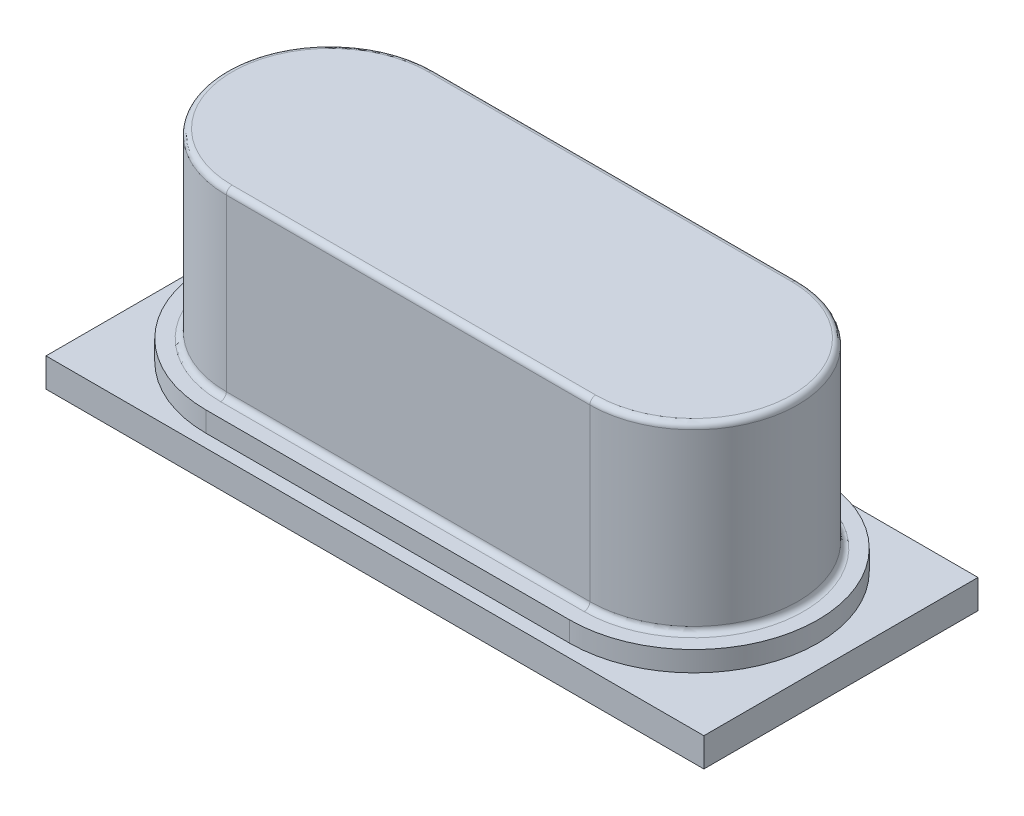
ISO-10303-21;
HEADER;
FILE_DESCRIPTION(('STEP AP214'),'2;1');
FILE_NAME('part.step','',(''),(''),'','','');
FILE_SCHEMA(('AUTOMOTIVE_DESIGN { 1 0 10303 214 1 1 1 1 }'));
ENDSEC;
DATA;
#1=APPLICATION_CONTEXT('core data for automotive mechanical design processes');
#2=APPLICATION_PROTOCOL_DEFINITION('international standard','automotive_design',2000,#1);
#3=PRODUCT_CONTEXT('',#1,'mechanical');
#4=PRODUCT('Part','Part','',(#3));
#5=PRODUCT_RELATED_PRODUCT_CATEGORY('part','',(#4));
#6=PRODUCT_DEFINITION_FORMATION('','',#4);
#7=PRODUCT_DEFINITION_CONTEXT('part definition',#1,'design');
#8=PRODUCT_DEFINITION('design','',#6,#7);
#9=PRODUCT_DEFINITION_SHAPE('','',#8);
#10=(LENGTH_UNIT() NAMED_UNIT(*) SI_UNIT(.MILLI.,.METRE.));
#11=(NAMED_UNIT(*) PLANE_ANGLE_UNIT() SI_UNIT($,.RADIAN.));
#12=(NAMED_UNIT(*) SI_UNIT($,.STERADIAN.) SOLID_ANGLE_UNIT());
#13=UNCERTAINTY_MEASURE_WITH_UNIT(LENGTH_MEASURE(1.E-05),#10,'distance_accuracy_value','');
#14=(GEOMETRIC_REPRESENTATION_CONTEXT(3) GLOBAL_UNCERTAINTY_ASSIGNED_CONTEXT((#13)) GLOBAL_UNIT_ASSIGNED_CONTEXT((#10,
#11,#12)) REPRESENTATION_CONTEXT('',''));
#15=CARTESIAN_POINT('',(0.,0.,0.));
#16=DIRECTION('',(0.,0.,1.));
#17=DIRECTION('',(1.,0.,0.));
#18=AXIS2_PLACEMENT_3D('',#15,#16,#17);
#19=CARTESIAN_POINT('',(0.,0.5,0.));
#20=DIRECTION('',(0.,-1.,0.));
#21=DIRECTION('',(0.,0.,-1.));
#22=AXIS2_PLACEMENT_3D('',#19,#20,#21);
#23=PLANE('',#22);
#24=DIRECTION('',(0.,0.,-1.));
#25=VECTOR('',#24,1.);
#26=CARTESIAN_POINT('',(5.7,0.5,2.375));
#27=LINE('',#26,#25);
#28=CARTESIAN_POINT('',(5.7,0.5,2.375));
#29=VERTEX_POINT('',#28);
#30=CARTESIAN_POINT('',(5.7,0.5,-2.375));
#31=VERTEX_POINT('',#30);
#32=EDGE_CURVE('E207',#29,#31,#27,.T.);
#33=ORIENTED_EDGE('',*,*,#32,.T.);
#34=DIRECTION('',(-1.,0.,0.));
#35=VECTOR('',#34,1.);
#36=CARTESIAN_POINT('',(-5.7,0.5,-2.375));
#37=LINE('',#36,#35);
#38=CARTESIAN_POINT('',(-5.7,0.5,-2.375));
#39=VERTEX_POINT('',#38);
#40=EDGE_CURVE('E211',#31,#39,#37,.T.);
#41=ORIENTED_EDGE('',*,*,#40,.T.);
#42=DIRECTION('',(0.,0.,1.));
#43=VECTOR('',#42,1.);
#44=CARTESIAN_POINT('',(-5.7,0.5,2.375));
#45=LINE('',#44,#43);
#46=CARTESIAN_POINT('',(-5.7,0.5,2.375));
#47=VERTEX_POINT('',#46);
#48=EDGE_CURVE('E215',#39,#47,#45,.T.);
#49=ORIENTED_EDGE('',*,*,#48,.T.);
#50=DIRECTION('',(1.,0.,0.));
#51=VECTOR('',#50,1.);
#52=CARTESIAN_POINT('',(-5.7,0.5,2.375));
#53=LINE('',#52,#51);
#54=EDGE_CURVE('E218',#47,#29,#53,.T.);
#55=ORIENTED_EDGE('',*,*,#54,.T.);
#56=EDGE_LOOP('',(#33,#41,#49,#55));
#57=FACE_BOUND('',#56,.T.);
#58=CARTESIAN_POINT('',(-3.15,0.5,0.));
#59=DIRECTION('',(0.,1.,0.));
#60=DIRECTION('',(0.,0.,1.));
#61=AXIS2_PLACEMENT_3D('',#58,#59,#60);
#62=CIRCLE('',#61,2.15);
#63=CARTESIAN_POINT('',(-3.15,0.5,-2.15));
#64=VERTEX_POINT('',#63);
#65=CARTESIAN_POINT('',(-3.15,0.5,2.15));
#66=VERTEX_POINT('',#65);
#67=EDGE_CURVE('E182',#64,#66,#62,.T.);
#68=ORIENTED_EDGE('',*,*,#67,.F.);
#69=DIRECTION('',(-1.,0.,0.));
#70=VECTOR('',#69,1.);
#71=CARTESIAN_POINT('',(-3.15,0.5,-2.15));
#72=LINE('',#71,#70);
#73=CARTESIAN_POINT('',(3.15,0.5,-2.15));
#74=VERTEX_POINT('',#73);
#75=EDGE_CURVE('E179',#74,#64,#72,.T.);
#76=ORIENTED_EDGE('',*,*,#75,.F.);
#77=CARTESIAN_POINT('',(3.15,0.5,0.));
#78=DIRECTION('',(0.,1.,0.));
#79=DIRECTION('',(0.,0.,1.));
#80=AXIS2_PLACEMENT_3D('',#77,#78,#79);
#81=CIRCLE('',#80,2.15);
#82=CARTESIAN_POINT('',(3.15,0.5,2.15));
#83=VERTEX_POINT('',#82);
#84=EDGE_CURVE('E574',#83,#74,#81,.T.);
#85=ORIENTED_EDGE('',*,*,#84,.F.);
#86=DIRECTION('',(1.,0.,0.));
#87=VECTOR('',#86,1.);
#88=CARTESIAN_POINT('',(-3.15,0.5,2.15));
#89=LINE('',#88,#87);
#90=EDGE_CURVE('E577',#66,#83,#89,.T.);
#91=ORIENTED_EDGE('',*,*,#90,.F.);
#92=EDGE_LOOP('',(#68,#76,#85,#91));
#93=FACE_BOUND('',#92,.T.);
#94=ADVANCED_FACE('F41',(#57,#93),#23,.F.);
#95=CARTESIAN_POINT('',(5.7,0.5,2.375));
#96=DIRECTION('',(-1.,0.,0.));
#97=DIRECTION('',(0.,0.,1.));
#98=AXIS2_PLACEMENT_3D('',#95,#96,#97);
#99=PLANE('',#98);
#100=DIRECTION('',(0.,0.,-1.));
#101=VECTOR('',#100,1.);
#102=CARTESIAN_POINT('',(5.7,0.,2.375));
#103=LINE('',#102,#101);
#104=CARTESIAN_POINT('',(5.7,0.,2.375));
#105=VERTEX_POINT('',#104);
#106=CARTESIAN_POINT('',(5.7,0.,-2.375));
#107=VERTEX_POINT('',#106);
#108=EDGE_CURVE('E206',#105,#107,#103,.T.);
#109=ORIENTED_EDGE('',*,*,#108,.T.);
#110=DIRECTION('',(0.,-1.,0.));
#111=VECTOR('',#110,1.);
#112=CARTESIAN_POINT('',(5.7,0.5,-2.375));
#113=LINE('',#112,#111);
#114=EDGE_CURVE('E244',#31,#107,#113,.T.);
#115=ORIENTED_EDGE('',*,*,#114,.F.);
#116=ORIENTED_EDGE('',*,*,#32,.F.);
#117=DIRECTION('',(0.,-1.,0.));
#118=VECTOR('',#117,1.);
#119=CARTESIAN_POINT('',(5.7,0.5,2.375));
#120=LINE('',#119,#118);
#121=EDGE_CURVE('E221',#29,#105,#120,.T.);
#122=ORIENTED_EDGE('',*,*,#121,.T.);
#123=EDGE_LOOP('',(#109,#115,#116,#122));
#124=FACE_BOUND('',#123,.T.);
#125=ADVANCED_FACE('F369',(#124),#99,.F.);
#126=CARTESIAN_POINT('',(-5.7,0.5,-2.375));
#127=DIRECTION('',(0.,0.,1.));
#128=DIRECTION('',(1.,0.,0.));
#129=AXIS2_PLACEMENT_3D('',#126,#127,#128);
#130=PLANE('',#129);
#131=DIRECTION('',(-1.,0.,0.));
#132=VECTOR('',#131,1.);
#133=CARTESIAN_POINT('',(-5.7,0.,-2.375));
#134=LINE('',#133,#132);
#135=CARTESIAN_POINT('',(-5.7,0.,-2.375));
#136=VERTEX_POINT('',#135);
#137=EDGE_CURVE('E225',#107,#136,#134,.T.);
#138=ORIENTED_EDGE('',*,*,#137,.T.);
#139=DIRECTION('',(0.,-1.,0.));
#140=VECTOR('',#139,1.);
#141=CARTESIAN_POINT('',(-5.7,0.5,-2.375));
#142=LINE('',#141,#140);
#143=EDGE_CURVE('E240',#39,#136,#142,.T.);
#144=ORIENTED_EDGE('',*,*,#143,.F.);
#145=ORIENTED_EDGE('',*,*,#40,.F.);
#146=ORIENTED_EDGE('',*,*,#114,.T.);
#147=EDGE_LOOP('',(#138,#144,#145,#146));
#148=FACE_BOUND('',#147,.T.);
#149=ADVANCED_FACE('F375',(#148),#130,.F.);
#150=CARTESIAN_POINT('',(-5.7,0.5,2.375));
#151=DIRECTION('',(1.,0.,0.));
#152=DIRECTION('',(0.,0.,-1.));
#153=AXIS2_PLACEMENT_3D('',#150,#151,#152);
#154=PLANE('',#153);
#155=DIRECTION('',(0.,0.,1.));
#156=VECTOR('',#155,1.);
#157=CARTESIAN_POINT('',(-5.7,0.,2.375));
#158=LINE('',#157,#156);
#159=CARTESIAN_POINT('',(-5.7,0.,2.375));
#160=VERTEX_POINT('',#159);
#161=EDGE_CURVE('E228',#136,#160,#158,.T.);
#162=ORIENTED_EDGE('',*,*,#161,.T.);
#163=DIRECTION('',(0.,-1.,0.));
#164=VECTOR('',#163,1.);
#165=CARTESIAN_POINT('',(-5.7,0.5,2.375));
#166=LINE('',#165,#164);
#167=EDGE_CURVE('E236',#47,#160,#166,.T.);
#168=ORIENTED_EDGE('',*,*,#167,.F.);
#169=ORIENTED_EDGE('',*,*,#48,.F.);
#170=ORIENTED_EDGE('',*,*,#143,.T.);
#171=EDGE_LOOP('',(#162,#168,#169,#170));
#172=FACE_BOUND('',#171,.T.);
#173=ADVANCED_FACE('F389',(#172),#154,.F.);
#174=CARTESIAN_POINT('',(-5.7,0.5,2.375));
#175=DIRECTION('',(0.,0.,-1.));
#176=DIRECTION('',(-1.,0.,0.));
#177=AXIS2_PLACEMENT_3D('',#174,#175,#176);
#178=PLANE('',#177);
#179=DIRECTION('',(1.,0.,0.));
#180=VECTOR('',#179,1.);
#181=CARTESIAN_POINT('',(-5.7,0.,2.375));
#182=LINE('',#181,#180);
#183=EDGE_CURVE('E212',#160,#105,#182,.T.);
#184=ORIENTED_EDGE('',*,*,#183,.T.);
#185=ORIENTED_EDGE('',*,*,#121,.F.);
#186=ORIENTED_EDGE('',*,*,#54,.F.);
#187=ORIENTED_EDGE('',*,*,#167,.T.);
#188=EDGE_LOOP('',(#184,#185,#186,#187));
#189=FACE_BOUND('',#188,.T.);
#190=ADVANCED_FACE('F385',(#189),#178,.F.);
#191=CARTESIAN_POINT('',(0.,0.,0.));
#192=DIRECTION('',(0.,-1.,0.));
#193=DIRECTION('',(0.,0.,-1.));
#194=AXIS2_PLACEMENT_3D('',#191,#192,#193);
#195=PLANE('',#194);
#196=ORIENTED_EDGE('',*,*,#108,.F.);
#197=ORIENTED_EDGE('',*,*,#183,.F.);
#198=ORIENTED_EDGE('',*,*,#161,.F.);
#199=ORIENTED_EDGE('',*,*,#137,.F.);
#200=EDGE_LOOP('',(#196,#197,#198,#199));
#201=FACE_BOUND('',#200,.T.);
#202=ADVANCED_FACE('F382',(#201),#195,.T.);
#203=CARTESIAN_POINT('',(-3.15,0.85,0.));
#204=DIRECTION('',(0.,1.,0.));
#205=DIRECTION('',(0.,0.,1.));
#206=AXIS2_PLACEMENT_3D('',#203,#204,#205);
#207=PLANE('',#206);
#208=DIRECTION('',(1.,0.,0.));
#209=VECTOR('',#208,1.);
#210=CARTESIAN_POINT('',(-3.15,0.85,1.9));
#211=LINE('',#210,#209);
#212=CARTESIAN_POINT('',(3.15,0.85,1.9));
#213=VERTEX_POINT('',#212);
#214=CARTESIAN_POINT('',(-3.15,0.85,1.9));
#215=VERTEX_POINT('',#214);
#216=EDGE_CURVE('E256',#213,#215,#211,.F.);
#217=ORIENTED_EDGE('',*,*,#216,.T.);
#218=CARTESIAN_POINT('',(-3.15,0.85,0.));
#219=DIRECTION('',(0.,1.,0.));
#220=DIRECTION('',(0.,0.,1.));
#221=AXIS2_PLACEMENT_3D('',#218,#219,#220);
#222=CIRCLE('',#221,1.9);
#223=CARTESIAN_POINT('',(-3.15,0.85,-1.9));
#224=VERTEX_POINT('',#223);
#225=EDGE_CURVE('E265',#215,#224,#222,.F.);
#226=ORIENTED_EDGE('',*,*,#225,.T.);
#227=DIRECTION('',(-1.,0.,0.));
#228=VECTOR('',#227,1.);
#229=CARTESIAN_POINT('',(3.15,0.85,-1.9));
#230=LINE('',#229,#228);
#231=CARTESIAN_POINT('',(3.15,0.85,-1.9));
#232=VERTEX_POINT('',#231);
#233=EDGE_CURVE('E262',#224,#232,#230,.F.);
#234=ORIENTED_EDGE('',*,*,#233,.T.);
#235=CARTESIAN_POINT('',(3.15,0.85,0.));
#236=DIRECTION('',(0.,1.,0.));
#237=DIRECTION('',(0.,0.,1.));
#238=AXIS2_PLACEMENT_3D('',#235,#236,#237);
#239=CIRCLE('',#238,1.9);
#240=EDGE_CURVE('E259',#232,#213,#239,.F.);
#241=ORIENTED_EDGE('',*,*,#240,.T.);
#242=EDGE_LOOP('',(#217,#226,#234,#241));
#243=FACE_BOUND('',#242,.T.);
#244=CARTESIAN_POINT('',(-3.15,0.85,0.));
#245=DIRECTION('',(0.,1.,0.));
#246=DIRECTION('',(0.,0.,1.));
#247=AXIS2_PLACEMENT_3D('',#244,#245,#246);
#248=CIRCLE('',#247,2.15);
#249=CARTESIAN_POINT('',(-3.15,0.85,-2.15));
#250=VERTEX_POINT('',#249);
#251=CARTESIAN_POINT('',(-3.15,0.85,2.15));
#252=VERTEX_POINT('',#251);
#253=EDGE_CURVE('E169',#250,#252,#248,.T.);
#254=ORIENTED_EDGE('',*,*,#253,.T.);
#255=DIRECTION('',(1.,0.,0.));
#256=VECTOR('',#255,1.);
#257=CARTESIAN_POINT('',(-3.15,0.85,2.15));
#258=LINE('',#257,#256);
#259=CARTESIAN_POINT('',(3.15,0.85,2.15));
#260=VERTEX_POINT('',#259);
#261=EDGE_CURVE('E156',#252,#260,#258,.T.);
#262=ORIENTED_EDGE('',*,*,#261,.T.);
#263=CARTESIAN_POINT('',(3.15,0.85,0.));
#264=DIRECTION('',(0.,1.,0.));
#265=DIRECTION('',(0.,0.,1.));
#266=AXIS2_PLACEMENT_3D('',#263,#264,#265);
#267=CIRCLE('',#266,2.15);
#268=CARTESIAN_POINT('',(3.15,0.85,-2.15));
#269=VERTEX_POINT('',#268);
#270=EDGE_CURVE('E168',#260,#269,#267,.T.);
#271=ORIENTED_EDGE('',*,*,#270,.T.);
#272=DIRECTION('',(-1.,0.,0.));
#273=VECTOR('',#272,1.);
#274=CARTESIAN_POINT('',(-3.15,0.85,-2.15));
#275=LINE('',#274,#273);
#276=EDGE_CURVE('E174',#269,#250,#275,.T.);
#277=ORIENTED_EDGE('',*,*,#276,.T.);
#278=EDGE_LOOP('',(#254,#262,#271,#277));
#279=FACE_BOUND('',#278,.T.);
#280=ADVANCED_FACE('F172',(#243,#279),#207,.T.);
#281=CARTESIAN_POINT('',(-3.15,0.85,0.));
#282=DIRECTION('',(0.,-1.,0.));
#283=DIRECTION('',(0.,0.,-1.));
#284=AXIS2_PLACEMENT_3D('',#281,#282,#283);
#285=CYLINDRICAL_SURFACE('',#284,2.15);
#286=ORIENTED_EDGE('',*,*,#67,.T.);
#287=DIRECTION('',(0.,-1.,0.));
#288=VECTOR('',#287,1.);
#289=CARTESIAN_POINT('',(-3.15,0.85,2.15));
#290=LINE('',#289,#288);
#291=EDGE_CURVE('E161',#252,#66,#290,.T.);
#292=ORIENTED_EDGE('',*,*,#291,.F.);
#293=ORIENTED_EDGE('',*,*,#253,.F.);
#294=DIRECTION('',(0.,-1.,0.));
#295=VECTOR('',#294,1.);
#296=CARTESIAN_POINT('',(-3.15,0.85,-2.15));
#297=LINE('',#296,#295);
#298=EDGE_CURVE('E581',#250,#64,#297,.T.);
#299=ORIENTED_EDGE('',*,*,#298,.T.);
#300=EDGE_LOOP('',(#286,#292,#293,#299));
#301=FACE_BOUND('',#300,.T.);
#302=ADVANCED_FACE('F181',(#301),#285,.T.);
#303=CARTESIAN_POINT('',(-3.15,0.85,2.15));
#304=DIRECTION('',(0.,0.,-1.));
#305=DIRECTION('',(-1.,0.,0.));
#306=AXIS2_PLACEMENT_3D('',#303,#304,#305);
#307=PLANE('',#306);
#308=ORIENTED_EDGE('',*,*,#90,.T.);
#309=DIRECTION('',(0.,-1.,0.));
#310=VECTOR('',#309,1.);
#311=CARTESIAN_POINT('',(3.15,0.85,2.15));
#312=LINE('',#311,#310);
#313=EDGE_CURVE('E164',#260,#83,#312,.T.);
#314=ORIENTED_EDGE('',*,*,#313,.F.);
#315=ORIENTED_EDGE('',*,*,#261,.F.);
#316=ORIENTED_EDGE('',*,*,#291,.T.);
#317=EDGE_LOOP('',(#308,#314,#315,#316));
#318=FACE_BOUND('',#317,.T.);
#319=ADVANCED_FACE('F159',(#318),#307,.F.);
#320=CARTESIAN_POINT('',(3.15,0.85,0.));
#321=DIRECTION('',(0.,-1.,0.));
#322=DIRECTION('',(0.,0.,-1.));
#323=AXIS2_PLACEMENT_3D('',#320,#321,#322);
#324=CYLINDRICAL_SURFACE('',#323,2.15);
#325=ORIENTED_EDGE('',*,*,#84,.T.);
#326=DIRECTION('',(0.,-1.,0.));
#327=VECTOR('',#326,1.);
#328=CARTESIAN_POINT('',(3.15,0.85,-2.15));
#329=LINE('',#328,#327);
#330=EDGE_CURVE('E191',#269,#74,#329,.T.);
#331=ORIENTED_EDGE('',*,*,#330,.F.);
#332=ORIENTED_EDGE('',*,*,#270,.F.);
#333=ORIENTED_EDGE('',*,*,#313,.T.);
#334=EDGE_LOOP('',(#325,#331,#332,#333));
#335=FACE_BOUND('',#334,.T.);
#336=ADVANCED_FACE('F426',(#335),#324,.T.);
#337=CARTESIAN_POINT('',(-3.15,0.85,-2.15));
#338=DIRECTION('',(0.,0.,1.));
#339=DIRECTION('',(1.,0.,0.));
#340=AXIS2_PLACEMENT_3D('',#337,#338,#339);
#341=PLANE('',#340);
#342=ORIENTED_EDGE('',*,*,#75,.T.);
#343=ORIENTED_EDGE('',*,*,#298,.F.);
#344=ORIENTED_EDGE('',*,*,#276,.F.);
#345=ORIENTED_EDGE('',*,*,#330,.T.);
#346=EDGE_LOOP('',(#342,#343,#344,#345));
#347=FACE_BOUND('',#346,.T.);
#348=ADVANCED_FACE('F419',(#347),#341,.F.);
#349=CARTESIAN_POINT('',(0.,4.,0.));
#350=DIRECTION('',(0.,1.,0.));
#351=DIRECTION('',(0.,0.,1.));
#352=AXIS2_PLACEMENT_3D('',#349,#350,#351);
#353=PLANE('',#352);
#354=DIRECTION('',(1.,0.,0.));
#355=VECTOR('',#354,1.);
#356=CARTESIAN_POINT('',(0.,4.,-1.7));
#357=LINE('',#356,#355);
#358=CARTESIAN_POINT('',(3.15,4.,-1.7));
#359=VERTEX_POINT('',#358);
#360=CARTESIAN_POINT('',(-3.15,4.,-1.7));
#361=VERTEX_POINT('',#360);
#362=EDGE_CURVE('E59',#359,#361,#357,.F.);
#363=ORIENTED_EDGE('',*,*,#362,.T.);
#364=CARTESIAN_POINT('',(-3.15,4.,0.));
#365=DIRECTION('',(0.,1.,0.));
#366=DIRECTION('',(0.,0.,1.));
#367=AXIS2_PLACEMENT_3D('',#364,#365,#366);
#368=CIRCLE('',#367,1.7);
#369=CARTESIAN_POINT('',(-3.15,4.,1.7));
#370=VERTEX_POINT('',#369);
#371=EDGE_CURVE('E288',#361,#370,#368,.T.);
#372=ORIENTED_EDGE('',*,*,#371,.T.);
#373=DIRECTION('',(1.,0.,0.));
#374=VECTOR('',#373,1.);
#375=CARTESIAN_POINT('',(3.15,4.,1.7));
#376=LINE('',#375,#374);
#377=CARTESIAN_POINT('',(3.15,4.,1.7));
#378=VERTEX_POINT('',#377);
#379=EDGE_CURVE('E281',#370,#378,#376,.T.);
#380=ORIENTED_EDGE('',*,*,#379,.T.);
#381=CARTESIAN_POINT('',(3.15,4.,0.));
#382=DIRECTION('',(0.,1.,0.));
#383=DIRECTION('',(0.,0.,1.));
#384=AXIS2_PLACEMENT_3D('',#381,#382,#383);
#385=CIRCLE('',#384,1.7);
#386=EDGE_CURVE('E64',#378,#359,#385,.T.);
#387=ORIENTED_EDGE('',*,*,#386,.T.);
#388=EDGE_LOOP('',(#363,#372,#380,#387));
#389=FACE_BOUND('',#388,.T.);
#390=ADVANCED_FACE('F417',(#389),#353,.T.);
#391=CARTESIAN_POINT('',(-3.15,4.,0.));
#392=DIRECTION('',(0.,-1.,0.));
#393=DIRECTION('',(0.,0.,-1.));
#394=AXIS2_PLACEMENT_3D('',#391,#392,#393);
#395=CYLINDRICAL_SURFACE('',#394,1.8);
#396=DIRECTION('',(0.,-1.,0.));
#397=VECTOR('',#396,1.);
#398=CARTESIAN_POINT('',(-3.15,4.,-1.8));
#399=LINE('',#398,#397);
#400=CARTESIAN_POINT('',(-3.15,3.9,-1.8));
#401=VERTEX_POINT('',#400);
#402=CARTESIAN_POINT('',(-3.15,0.95,-1.8));
#403=VERTEX_POINT('',#402);
#404=EDGE_CURVE('E189',#401,#403,#399,.T.);
#405=ORIENTED_EDGE('',*,*,#404,.T.);
#406=CARTESIAN_POINT('',(-3.15,0.95,0.));
#407=DIRECTION('',(0.,1.,0.));
#408=DIRECTION('',(0.,0.,1.));
#409=AXIS2_PLACEMENT_3D('',#406,#407,#408);
#410=CIRCLE('',#409,1.8);
#411=CARTESIAN_POINT('',(-3.15,0.95,1.8));
#412=VERTEX_POINT('',#411);
#413=EDGE_CURVE('E252',#403,#412,#410,.T.);
#414=ORIENTED_EDGE('',*,*,#413,.T.);
#415=DIRECTION('',(0.,-1.,0.));
#416=VECTOR('',#415,1.);
#417=CARTESIAN_POINT('',(-3.15,4.,1.8));
#418=LINE('',#417,#416);
#419=CARTESIAN_POINT('',(-3.15,3.9,1.8));
#420=VERTEX_POINT('',#419);
#421=EDGE_CURVE('E184',#420,#412,#418,.T.);
#422=ORIENTED_EDGE('',*,*,#421,.F.);
#423=CARTESIAN_POINT('',(-3.15,3.9,0.));
#424=DIRECTION('',(0.,1.,0.));
#425=DIRECTION('',(0.,0.,1.));
#426=AXIS2_PLACEMENT_3D('',#423,#424,#425);
#427=CIRCLE('',#426,1.8);
#428=EDGE_CURVE('E248',#420,#401,#427,.F.);
#429=ORIENTED_EDGE('',*,*,#428,.T.);
#430=EDGE_LOOP('',(#405,#414,#422,#429));
#431=FACE_BOUND('',#430,.T.);
#432=ADVANCED_FACE('F342',(#431),#395,.T.);
#433=CARTESIAN_POINT('',(0.,4.,-1.8));
#434=DIRECTION('',(0.,0.,-1.));
#435=DIRECTION('',(-1.,0.,0.));
#436=AXIS2_PLACEMENT_3D('',#433,#434,#435);
#437=PLANE('',#436);
#438=DIRECTION('',(0.,-1.,0.));
#439=VECTOR('',#438,1.);
#440=CARTESIAN_POINT('',(3.15,4.,-1.8));
#441=LINE('',#440,#439);
#442=CARTESIAN_POINT('',(3.15,3.9,-1.8));
#443=VERTEX_POINT('',#442);
#444=CARTESIAN_POINT('',(3.15,0.95,-1.8));
#445=VERTEX_POINT('',#444);
#446=EDGE_CURVE('E198',#443,#445,#441,.T.);
#447=ORIENTED_EDGE('',*,*,#446,.T.);
#448=DIRECTION('',(-1.,0.,0.));
#449=VECTOR('',#448,1.);
#450=CARTESIAN_POINT('',(-3.15,0.95,-1.8));
#451=LINE('',#450,#449);
#452=EDGE_CURVE('E272',#445,#403,#451,.T.);
#453=ORIENTED_EDGE('',*,*,#452,.T.);
#454=ORIENTED_EDGE('',*,*,#404,.F.);
#455=DIRECTION('',(1.,0.,0.));
#456=VECTOR('',#455,1.);
#457=CARTESIAN_POINT('',(0.,3.9,-1.8));
#458=LINE('',#457,#456);
#459=EDGE_CURVE('E269',#401,#443,#458,.T.);
#460=ORIENTED_EDGE('',*,*,#459,.T.);
#461=EDGE_LOOP('',(#447,#453,#454,#460));
#462=FACE_BOUND('',#461,.T.);
#463=ADVANCED_FACE('F357',(#462),#437,.T.);
#464=CARTESIAN_POINT('',(3.15,4.,0.));
#465=DIRECTION('',(0.,-1.,0.));
#466=DIRECTION('',(0.,0.,-1.));
#467=AXIS2_PLACEMENT_3D('',#464,#465,#466);
#468=CYLINDRICAL_SURFACE('',#467,1.8);
#469=DIRECTION('',(0.,-1.,0.));
#470=VECTOR('',#469,1.);
#471=CARTESIAN_POINT('',(3.15,4.,1.8));
#472=LINE('',#471,#470);
#473=CARTESIAN_POINT('',(3.15,3.9,1.8));
#474=VERTEX_POINT('',#473);
#475=CARTESIAN_POINT('',(3.15,0.95,1.8));
#476=VERTEX_POINT('',#475);
#477=EDGE_CURVE('E202',#474,#476,#472,.T.);
#478=ORIENTED_EDGE('',*,*,#477,.T.);
#479=CARTESIAN_POINT('',(3.15,0.95,0.));
#480=DIRECTION('',(0.,1.,0.));
#481=DIRECTION('',(0.,0.,1.));
#482=AXIS2_PLACEMENT_3D('',#479,#480,#481);
#483=CIRCLE('',#482,1.8);
#484=EDGE_CURVE('E278',#476,#445,#483,.T.);
#485=ORIENTED_EDGE('',*,*,#484,.T.);
#486=ORIENTED_EDGE('',*,*,#446,.F.);
#487=CARTESIAN_POINT('',(3.15,3.9,0.));
#488=DIRECTION('',(0.,1.,0.));
#489=DIRECTION('',(0.,0.,1.));
#490=AXIS2_PLACEMENT_3D('',#487,#488,#489);
#491=CIRCLE('',#490,1.8);
#492=EDGE_CURVE('E275',#443,#474,#491,.F.);
#493=ORIENTED_EDGE('',*,*,#492,.T.);
#494=EDGE_LOOP('',(#478,#485,#486,#493));
#495=FACE_BOUND('',#494,.T.);
#496=ADVANCED_FACE('F329',(#495),#468,.T.);
#497=CARTESIAN_POINT('',(0.,4.,1.8));
#498=DIRECTION('',(0.,0.,-1.));
#499=DIRECTION('',(-1.,0.,0.));
#500=AXIS2_PLACEMENT_3D('',#497,#498,#499);
#501=PLANE('',#500);
#502=ORIENTED_EDGE('',*,*,#477,.F.);
#503=DIRECTION('',(1.,0.,0.));
#504=VECTOR('',#503,1.);
#505=CARTESIAN_POINT('',(-3.15,3.9,1.8));
#506=LINE('',#505,#504);
#507=EDGE_CURVE('E11',#474,#420,#506,.F.);
#508=ORIENTED_EDGE('',*,*,#507,.T.);
#509=ORIENTED_EDGE('',*,*,#421,.T.);
#510=DIRECTION('',(1.,0.,0.));
#511=VECTOR('',#510,1.);
#512=CARTESIAN_POINT('',(0.,0.95,1.8));
#513=LINE('',#512,#511);
#514=EDGE_CURVE('E51',#412,#476,#513,.T.);
#515=ORIENTED_EDGE('',*,*,#514,.T.);
#516=EDGE_LOOP('',(#502,#508,#509,#515));
#517=FACE_BOUND('',#516,.T.);
#518=ADVANCED_FACE('F332',(#517),#501,.F.);
#519=CARTESIAN_POINT('',(3.15,0.95,0.));
#520=DIRECTION('',(0.,1.,0.));
#521=DIRECTION('',(0.,0.,1.));
#522=AXIS2_PLACEMENT_3D('',#519,#520,#521);
#523=TOROIDAL_SURFACE('',#522,1.9,0.1);
#524=CARTESIAN_POINT('',(3.15,0.95,1.9));
#525=DIRECTION('',(1.,0.,0.));
#526=DIRECTION('',(0.,0.,-1.));
#527=AXIS2_PLACEMENT_3D('',#524,#525,#526);
#528=CIRCLE('',#527,0.1);
#529=EDGE_CURVE('E299',#213,#476,#528,.T.);
#530=ORIENTED_EDGE('',*,*,#529,.F.);
#531=ORIENTED_EDGE('',*,*,#240,.F.);
#532=CARTESIAN_POINT('',(3.15,0.95,-1.9));
#533=DIRECTION('',(1.,0.,0.));
#534=DIRECTION('',(0.,0.,-1.));
#535=AXIS2_PLACEMENT_3D('',#532,#533,#534);
#536=CIRCLE('',#535,0.1);
#537=EDGE_CURVE('E303',#445,#232,#536,.T.);
#538=ORIENTED_EDGE('',*,*,#537,.F.);
#539=ORIENTED_EDGE('',*,*,#484,.F.);
#540=EDGE_LOOP('',(#530,#531,#538,#539));
#541=FACE_BOUND('',#540,.T.);
#542=ADVANCED_FACE('F354',(#541),#523,.F.);
#543=CARTESIAN_POINT('',(0.,0.95,-1.9));
#544=DIRECTION('',(1.,0.,0.));
#545=DIRECTION('',(0.,0.,-1.));
#546=AXIS2_PLACEMENT_3D('',#543,#544,#545);
#547=CYLINDRICAL_SURFACE('',#546,0.1);
#548=ORIENTED_EDGE('',*,*,#537,.T.);
#549=ORIENTED_EDGE('',*,*,#233,.F.);
#550=CARTESIAN_POINT('',(-3.15,0.95,-1.9));
#551=DIRECTION('',(1.,0.,0.));
#552=DIRECTION('',(0.,0.,-1.));
#553=AXIS2_PLACEMENT_3D('',#550,#551,#552);
#554=CIRCLE('',#553,0.1);
#555=EDGE_CURVE('E296',#403,#224,#554,.T.);
#556=ORIENTED_EDGE('',*,*,#555,.F.);
#557=ORIENTED_EDGE('',*,*,#452,.F.);
#558=EDGE_LOOP('',(#548,#549,#556,#557));
#559=FACE_BOUND('',#558,.T.);
#560=ADVANCED_FACE('F359',(#559),#547,.F.);
#561=CARTESIAN_POINT('',(0.,0.95,1.9));
#562=DIRECTION('',(1.,0.,0.));
#563=DIRECTION('',(0.,0.,-1.));
#564=AXIS2_PLACEMENT_3D('',#561,#562,#563);
#565=CYLINDRICAL_SURFACE('',#564,0.1);
#566=ORIENTED_EDGE('',*,*,#529,.T.);
#567=ORIENTED_EDGE('',*,*,#514,.F.);
#568=CARTESIAN_POINT('',(-3.15,0.95,1.9));
#569=DIRECTION('',(1.,0.,0.));
#570=DIRECTION('',(0.,0.,-1.));
#571=AXIS2_PLACEMENT_3D('',#568,#569,#570);
#572=CIRCLE('',#571,0.1);
#573=EDGE_CURVE('E293',#215,#412,#572,.T.);
#574=ORIENTED_EDGE('',*,*,#573,.F.);
#575=ORIENTED_EDGE('',*,*,#216,.F.);
#576=EDGE_LOOP('',(#566,#567,#574,#575));
#577=FACE_BOUND('',#576,.T.);
#578=ADVANCED_FACE('F337',(#577),#565,.F.);
#579=CARTESIAN_POINT('',(-3.15,0.95,0.));
#580=DIRECTION('',(0.,1.,0.));
#581=DIRECTION('',(0.,0.,1.));
#582=AXIS2_PLACEMENT_3D('',#579,#580,#581);
#583=TOROIDAL_SURFACE('',#582,1.9,0.1);
#584=ORIENTED_EDGE('',*,*,#555,.T.);
#585=ORIENTED_EDGE('',*,*,#225,.F.);
#586=ORIENTED_EDGE('',*,*,#573,.T.);
#587=ORIENTED_EDGE('',*,*,#413,.F.);
#588=EDGE_LOOP('',(#584,#585,#586,#587));
#589=FACE_BOUND('',#588,.T.);
#590=ADVANCED_FACE('F347',(#589),#583,.F.);
#591=CARTESIAN_POINT('',(3.15,3.9,0.));
#592=DIRECTION('',(0.,1.,0.));
#593=DIRECTION('',(0.,0.,1.));
#594=AXIS2_PLACEMENT_3D('',#591,#592,#593);
#595=TOROIDAL_SURFACE('',#594,1.7,0.1);
#596=CARTESIAN_POINT('',(3.15,3.9,1.7));
#597=DIRECTION('',(-1.,0.,0.));
#598=DIRECTION('',(0.,0.,1.));
#599=AXIS2_PLACEMENT_3D('',#596,#597,#598);
#600=CIRCLE('',#599,0.1);
#601=EDGE_CURVE('E312',#474,#378,#600,.T.);
#602=ORIENTED_EDGE('',*,*,#601,.F.);
#603=ORIENTED_EDGE('',*,*,#492,.F.);
#604=CARTESIAN_POINT('',(3.15,3.9,-1.7));
#605=DIRECTION('',(-1.,0.,0.));
#606=DIRECTION('',(0.,0.,1.));
#607=AXIS2_PLACEMENT_3D('',#604,#605,#606);
#608=CIRCLE('',#607,0.1);
#609=EDGE_CURVE('E45',#359,#443,#608,.T.);
#610=ORIENTED_EDGE('',*,*,#609,.F.);
#611=ORIENTED_EDGE('',*,*,#386,.F.);
#612=EDGE_LOOP('',(#602,#603,#610,#611));
#613=FACE_BOUND('',#612,.T.);
#614=ADVANCED_FACE('F43',(#613),#595,.T.);
#615=CARTESIAN_POINT('',(0.,3.9,-1.7));
#616=DIRECTION('',(1.,0.,0.));
#617=DIRECTION('',(0.,0.,-1.));
#618=AXIS2_PLACEMENT_3D('',#615,#616,#617);
#619=CYLINDRICAL_SURFACE('',#618,0.1);
#620=ORIENTED_EDGE('',*,*,#609,.T.);
#621=ORIENTED_EDGE('',*,*,#459,.F.);
#622=CARTESIAN_POINT('',(-3.15,3.9,-1.7));
#623=DIRECTION('',(-1.,0.,0.));
#624=DIRECTION('',(0.,0.,1.));
#625=AXIS2_PLACEMENT_3D('',#622,#623,#624);
#626=CIRCLE('',#625,0.1);
#627=EDGE_CURVE('E310',#361,#401,#626,.T.);
#628=ORIENTED_EDGE('',*,*,#627,.F.);
#629=ORIENTED_EDGE('',*,*,#362,.F.);
#630=EDGE_LOOP('',(#620,#621,#628,#629));
#631=FACE_BOUND('',#630,.T.);
#632=ADVANCED_FACE('F323',(#631),#619,.T.);
#633=CARTESIAN_POINT('',(0.,3.9,1.7));
#634=DIRECTION('',(-1.,0.,0.));
#635=DIRECTION('',(0.,0.,1.));
#636=AXIS2_PLACEMENT_3D('',#633,#634,#635);
#637=CYLINDRICAL_SURFACE('',#636,0.1);
#638=ORIENTED_EDGE('',*,*,#601,.T.);
#639=ORIENTED_EDGE('',*,*,#379,.F.);
#640=CARTESIAN_POINT('',(-3.15,3.9,1.7));
#641=DIRECTION('',(-1.,0.,0.));
#642=DIRECTION('',(0.,0.,1.));
#643=AXIS2_PLACEMENT_3D('',#640,#641,#642);
#644=CIRCLE('',#643,0.1);
#645=EDGE_CURVE('E307',#420,#370,#644,.T.);
#646=ORIENTED_EDGE('',*,*,#645,.F.);
#647=ORIENTED_EDGE('',*,*,#507,.F.);
#648=EDGE_LOOP('',(#638,#639,#646,#647));
#649=FACE_BOUND('',#648,.T.);
#650=ADVANCED_FACE('F404',(#649),#637,.T.);
#651=CARTESIAN_POINT('',(-3.15,3.9,0.));
#652=DIRECTION('',(0.,1.,0.));
#653=DIRECTION('',(0.,0.,1.));
#654=AXIS2_PLACEMENT_3D('',#651,#652,#653);
#655=TOROIDAL_SURFACE('',#654,1.7,0.1);
#656=ORIENTED_EDGE('',*,*,#627,.T.);
#657=ORIENTED_EDGE('',*,*,#428,.F.);
#658=ORIENTED_EDGE('',*,*,#645,.T.);
#659=ORIENTED_EDGE('',*,*,#371,.F.);
#660=EDGE_LOOP('',(#656,#657,#658,#659));
#661=FACE_BOUND('',#660,.T.);
#662=ADVANCED_FACE('F408',(#661),#655,.T.);
#663=CLOSED_SHELL('',(#94,#125,#149,#173,#190,#202,#280,#302,#319,#336,#348,#390,#432,#463,#496,
#518,#542,#560,#578,#590,#614,#632,#650,#662));
#664=MANIFOLD_SOLID_BREP('B2',#663);
#665=ADVANCED_BREP_SHAPE_REPRESENTATION('',(#18,#664),#14);
#666=SHAPE_DEFINITION_REPRESENTATION(#9,#665);
ENDSEC;
END-ISO-10303-21;
